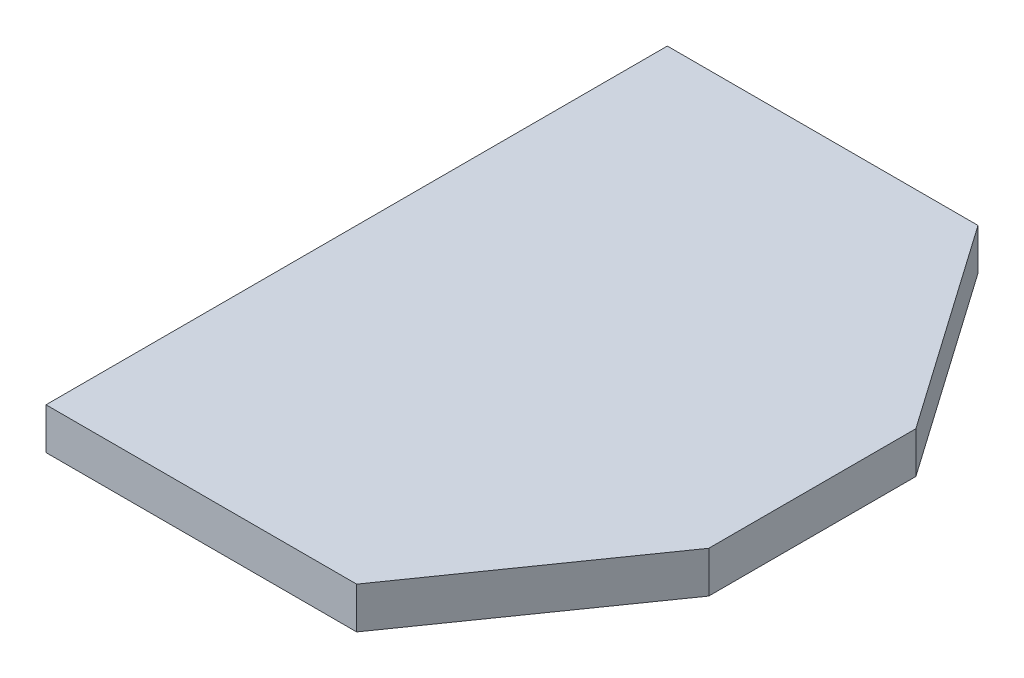
ISO-10303-21;
HEADER;
FILE_DESCRIPTION(('STEP AP214'),'2;1');
FILE_NAME('part.step','',(''),(''),'','','');
FILE_SCHEMA(('AUTOMOTIVE_DESIGN { 1 0 10303 214 1 1 1 1 }'));
ENDSEC;
DATA;
#1=APPLICATION_CONTEXT('core data for automotive mechanical design processes');
#2=APPLICATION_PROTOCOL_DEFINITION('international standard','automotive_design',2000,#1);
#3=PRODUCT_CONTEXT('',#1,'mechanical');
#4=PRODUCT('Part','Part','',(#3));
#5=PRODUCT_RELATED_PRODUCT_CATEGORY('part','',(#4));
#6=PRODUCT_DEFINITION_FORMATION('','',#4);
#7=PRODUCT_DEFINITION_CONTEXT('part definition',#1,'design');
#8=PRODUCT_DEFINITION('design','',#6,#7);
#9=PRODUCT_DEFINITION_SHAPE('','',#8);
#10=(LENGTH_UNIT() NAMED_UNIT(*) SI_UNIT(.MILLI.,.METRE.));
#11=(NAMED_UNIT(*) PLANE_ANGLE_UNIT() SI_UNIT($,.RADIAN.));
#12=(NAMED_UNIT(*) SI_UNIT($,.STERADIAN.) SOLID_ANGLE_UNIT());
#13=UNCERTAINTY_MEASURE_WITH_UNIT(LENGTH_MEASURE(1.E-05),#10,'distance_accuracy_value','');
#14=(GEOMETRIC_REPRESENTATION_CONTEXT(3) GLOBAL_UNCERTAINTY_ASSIGNED_CONTEXT((#13)) GLOBAL_UNIT_ASSIGNED_CONTEXT((#10,
#11,#12)) REPRESENTATION_CONTEXT('',''));
#15=CARTESIAN_POINT('',(0.,0.,0.));
#16=DIRECTION('',(0.,0.,1.));
#17=DIRECTION('',(1.,0.,0.));
#18=AXIS2_PLACEMENT_3D('',#15,#16,#17);
#19=CARTESIAN_POINT('',(104.,5.,-125.));
#20=DIRECTION('',(-0.81923192051904,0.,0.573462344363328));
#21=DIRECTION('',(0.573462344363328,0.,0.81923192051904));
#22=AXIS2_PLACEMENT_3D('',#19,#20,#21);
#23=PLANE('',#22);
#24=DIRECTION('',(-0.573462344363328,0.,-0.81923192051904));
#25=VECTOR('',#24,1.);
#26=CARTESIAN_POINT('',(104.,-5.,-125.));
#27=LINE('',#26,#25);
#28=CARTESIAN_POINT('',(139.,-5.,-75.));
#29=VERTEX_POINT('',#28);
#30=CARTESIAN_POINT('',(104.,-5.,-125.));
#31=VERTEX_POINT('',#30);
#32=EDGE_CURVE('E128',#29,#31,#27,.T.);
#33=ORIENTED_EDGE('',*,*,#32,.T.);
#34=DIRECTION('',(0.,-1.,0.));
#35=VECTOR('',#34,1.);
#36=CARTESIAN_POINT('',(104.,5.,-125.));
#37=LINE('',#36,#35);
#38=CARTESIAN_POINT('',(104.,5.,-125.));
#39=VERTEX_POINT('',#38);
#40=EDGE_CURVE('E11',#39,#31,#37,.T.);
#41=ORIENTED_EDGE('',*,*,#40,.F.);
#42=DIRECTION('',(-0.573462344363328,0.,-0.81923192051904));
#43=VECTOR('',#42,1.);
#44=CARTESIAN_POINT('',(104.,5.,-125.));
#45=LINE('',#44,#43);
#46=CARTESIAN_POINT('',(139.,5.,-75.));
#47=VERTEX_POINT('',#46);
#48=EDGE_CURVE('E144',#47,#39,#45,.T.);
#49=ORIENTED_EDGE('',*,*,#48,.F.);
#50=DIRECTION('',(0.,-1.,0.));
#51=VECTOR('',#50,1.);
#52=CARTESIAN_POINT('',(139.,5.,-75.));
#53=LINE('',#52,#51);
#54=EDGE_CURVE('E124',#47,#29,#53,.T.);
#55=ORIENTED_EDGE('',*,*,#54,.T.);
#56=EDGE_LOOP('',(#33,#41,#49,#55));
#57=FACE_BOUND('',#56,.T.);
#58=ADVANCED_FACE('F39',(#57),#23,.F.);
#59=CARTESIAN_POINT('',(29.,5.,-125.));
#60=DIRECTION('',(0.,0.,1.));
#61=DIRECTION('',(1.,0.,0.));
#62=AXIS2_PLACEMENT_3D('',#59,#60,#61);
#63=PLANE('',#62);
#64=DIRECTION('',(-1.,0.,0.));
#65=VECTOR('',#64,1.);
#66=CARTESIAN_POINT('',(29.,-5.,-125.));
#67=LINE('',#66,#65);
#68=CARTESIAN_POINT('',(29.,-5.,-125.));
#69=VERTEX_POINT('',#68);
#70=EDGE_CURVE('E132',#31,#69,#67,.T.);
#71=ORIENTED_EDGE('',*,*,#70,.T.);
#72=DIRECTION('',(0.,-1.,0.));
#73=VECTOR('',#72,1.);
#74=CARTESIAN_POINT('',(29.,5.,-125.));
#75=LINE('',#74,#73);
#76=CARTESIAN_POINT('',(29.,5.,-125.));
#77=VERTEX_POINT('',#76);
#78=EDGE_CURVE('E48',#77,#69,#75,.T.);
#79=ORIENTED_EDGE('',*,*,#78,.F.);
#80=DIRECTION('',(-1.,0.,0.));
#81=VECTOR('',#80,1.);
#82=CARTESIAN_POINT('',(29.,5.,-125.));
#83=LINE('',#82,#81);
#84=EDGE_CURVE('E93',#39,#77,#83,.T.);
#85=ORIENTED_EDGE('',*,*,#84,.F.);
#86=ORIENTED_EDGE('',*,*,#40,.T.);
#87=EDGE_LOOP('',(#71,#79,#85,#86));
#88=FACE_BOUND('',#87,.T.);
#89=ADVANCED_FACE('F172',(#88),#63,.F.);
#90=CARTESIAN_POINT('',(29.,5.,25.));
#91=DIRECTION('',(1.,0.,0.));
#92=DIRECTION('',(0.,0.,-1.));
#93=AXIS2_PLACEMENT_3D('',#90,#91,#92);
#94=PLANE('',#93);
#95=DIRECTION('',(0.,0.,1.));
#96=VECTOR('',#95,1.);
#97=CARTESIAN_POINT('',(29.,-5.,25.));
#98=LINE('',#97,#96);
#99=CARTESIAN_POINT('',(29.,-5.,25.));
#100=VERTEX_POINT('',#99);
#101=EDGE_CURVE('E135',#69,#100,#98,.T.);
#102=ORIENTED_EDGE('',*,*,#101,.T.);
#103=DIRECTION('',(0.,-1.,0.));
#104=VECTOR('',#103,1.);
#105=CARTESIAN_POINT('',(29.,5.,25.));
#106=LINE('',#105,#104);
#107=CARTESIAN_POINT('',(29.,5.,25.));
#108=VERTEX_POINT('',#107);
#109=EDGE_CURVE('E117',#108,#100,#106,.T.);
#110=ORIENTED_EDGE('',*,*,#109,.F.);
#111=DIRECTION('',(0.,0.,1.));
#112=VECTOR('',#111,1.);
#113=CARTESIAN_POINT('',(29.,5.,25.));
#114=LINE('',#113,#112);
#115=EDGE_CURVE('E106',#77,#108,#114,.T.);
#116=ORIENTED_EDGE('',*,*,#115,.F.);
#117=ORIENTED_EDGE('',*,*,#78,.T.);
#118=EDGE_LOOP('',(#102,#110,#116,#117));
#119=FACE_BOUND('',#118,.T.);
#120=ADVANCED_FACE('F154',(#119),#94,.F.);
#121=CARTESIAN_POINT('',(29.,5.,25.));
#122=DIRECTION('',(0.,0.,-1.));
#123=DIRECTION('',(-1.,0.,0.));
#124=AXIS2_PLACEMENT_3D('',#121,#122,#123);
#125=PLANE('',#124);
#126=DIRECTION('',(1.,0.,0.));
#127=VECTOR('',#126,1.);
#128=CARTESIAN_POINT('',(29.,-5.,25.));
#129=LINE('',#128,#127);
#130=CARTESIAN_POINT('',(104.,-5.,25.));
#131=VERTEX_POINT('',#130);
#132=EDGE_CURVE('E115',#100,#131,#129,.T.);
#133=ORIENTED_EDGE('',*,*,#132,.T.);
#134=DIRECTION('',(0.,-1.,0.));
#135=VECTOR('',#134,1.);
#136=CARTESIAN_POINT('',(104.,5.,25.));
#137=LINE('',#136,#135);
#138=CARTESIAN_POINT('',(104.,5.,25.));
#139=VERTEX_POINT('',#138);
#140=EDGE_CURVE('E112',#139,#131,#137,.T.);
#141=ORIENTED_EDGE('',*,*,#140,.F.);
#142=DIRECTION('',(1.,0.,0.));
#143=VECTOR('',#142,1.);
#144=CARTESIAN_POINT('',(29.,5.,25.));
#145=LINE('',#144,#143);
#146=EDGE_CURVE('E100',#108,#139,#145,.T.);
#147=ORIENTED_EDGE('',*,*,#146,.F.);
#148=ORIENTED_EDGE('',*,*,#109,.T.);
#149=EDGE_LOOP('',(#133,#141,#147,#148));
#150=FACE_BOUND('',#149,.T.);
#151=ADVANCED_FACE('F113',(#150),#125,.F.);
#152=CARTESIAN_POINT('',(104.,5.,25.));
#153=DIRECTION('',(-0.819231920519041,0.,-0.573462344363328));
#154=DIRECTION('',(-0.573462344363328,0.,0.819231920519041));
#155=AXIS2_PLACEMENT_3D('',#152,#153,#154);
#156=PLANE('',#155);
#157=DIRECTION('',(0.573462344363328,0.,-0.819231920519041));
#158=VECTOR('',#157,1.);
#159=CARTESIAN_POINT('',(104.,-5.,25.));
#160=LINE('',#159,#158);
#161=CARTESIAN_POINT('',(139.,-5.,-25.));
#162=VERTEX_POINT('',#161);
#163=EDGE_CURVE('E79',#131,#162,#160,.T.);
#164=ORIENTED_EDGE('',*,*,#163,.T.);
#165=DIRECTION('',(0.,-1.,0.));
#166=VECTOR('',#165,1.);
#167=CARTESIAN_POINT('',(139.,5.,-25.));
#168=LINE('',#167,#166);
#169=CARTESIAN_POINT('',(139.,5.,-25.));
#170=VERTEX_POINT('',#169);
#171=EDGE_CURVE('E118',#170,#162,#168,.T.);
#172=ORIENTED_EDGE('',*,*,#171,.F.);
#173=DIRECTION('',(0.573462344363328,0.,-0.819231920519041));
#174=VECTOR('',#173,1.);
#175=CARTESIAN_POINT('',(104.,5.,25.));
#176=LINE('',#175,#174);
#177=EDGE_CURVE('E104',#139,#170,#176,.T.);
#178=ORIENTED_EDGE('',*,*,#177,.F.);
#179=ORIENTED_EDGE('',*,*,#140,.T.);
#180=EDGE_LOOP('',(#164,#172,#178,#179));
#181=FACE_BOUND('',#180,.T.);
#182=ADVANCED_FACE('F120',(#181),#156,.F.);
#183=CARTESIAN_POINT('',(139.,5.,-25.));
#184=DIRECTION('',(-1.,0.,0.));
#185=DIRECTION('',(0.,0.,1.));
#186=AXIS2_PLACEMENT_3D('',#183,#184,#185);
#187=PLANE('',#186);
#188=DIRECTION('',(0.,0.,-1.));
#189=VECTOR('',#188,1.);
#190=CARTESIAN_POINT('',(139.,-5.,-25.));
#191=LINE('',#190,#189);
#192=EDGE_CURVE('E85',#162,#29,#191,.T.);
#193=ORIENTED_EDGE('',*,*,#192,.T.);
#194=ORIENTED_EDGE('',*,*,#54,.F.);
#195=DIRECTION('',(0.,0.,-1.));
#196=VECTOR('',#195,1.);
#197=CARTESIAN_POINT('',(139.,5.,-25.));
#198=LINE('',#197,#196);
#199=EDGE_CURVE('E56',#170,#47,#198,.T.);
#200=ORIENTED_EDGE('',*,*,#199,.F.);
#201=ORIENTED_EDGE('',*,*,#171,.T.);
#202=EDGE_LOOP('',(#193,#194,#200,#201));
#203=FACE_BOUND('',#202,.T.);
#204=ADVANCED_FACE('F161',(#203),#187,.F.);
#205=CARTESIAN_POINT('',(0.,5.,0.));
#206=DIRECTION('',(0.,1.,0.));
#207=DIRECTION('',(0.,0.,1.));
#208=AXIS2_PLACEMENT_3D('',#205,#206,#207);
#209=PLANE('',#208);
#210=ORIENTED_EDGE('',*,*,#48,.T.);
#211=ORIENTED_EDGE('',*,*,#84,.T.);
#212=ORIENTED_EDGE('',*,*,#115,.T.);
#213=ORIENTED_EDGE('',*,*,#146,.T.);
#214=ORIENTED_EDGE('',*,*,#177,.T.);
#215=ORIENTED_EDGE('',*,*,#199,.T.);
#216=EDGE_LOOP('',(#210,#211,#212,#213,#214,#215));
#217=FACE_BOUND('',#216,.T.);
#218=ADVANCED_FACE('F102',(#217),#209,.T.);
#219=CARTESIAN_POINT('',(0.,-5.,0.));
#220=DIRECTION('',(0.,1.,0.));
#221=DIRECTION('',(0.,0.,1.));
#222=AXIS2_PLACEMENT_3D('',#219,#220,#221);
#223=PLANE('',#222);
#224=ORIENTED_EDGE('',*,*,#32,.F.);
#225=ORIENTED_EDGE('',*,*,#192,.F.);
#226=ORIENTED_EDGE('',*,*,#163,.F.);
#227=ORIENTED_EDGE('',*,*,#132,.F.);
#228=ORIENTED_EDGE('',*,*,#101,.F.);
#229=ORIENTED_EDGE('',*,*,#70,.F.);
#230=EDGE_LOOP('',(#224,#225,#226,#227,#228,#229));
#231=FACE_BOUND('',#230,.T.);
#232=ADVANCED_FACE('F157',(#231),#223,.F.);
#233=CLOSED_SHELL('',(#58,#89,#120,#151,#182,#204,#218,#232));
#234=MANIFOLD_SOLID_BREP('B2',#233);
#235=ADVANCED_BREP_SHAPE_REPRESENTATION('',(#18,#234),#14);
#236=SHAPE_DEFINITION_REPRESENTATION(#9,#235);
ENDSEC;
END-ISO-10303-21;
